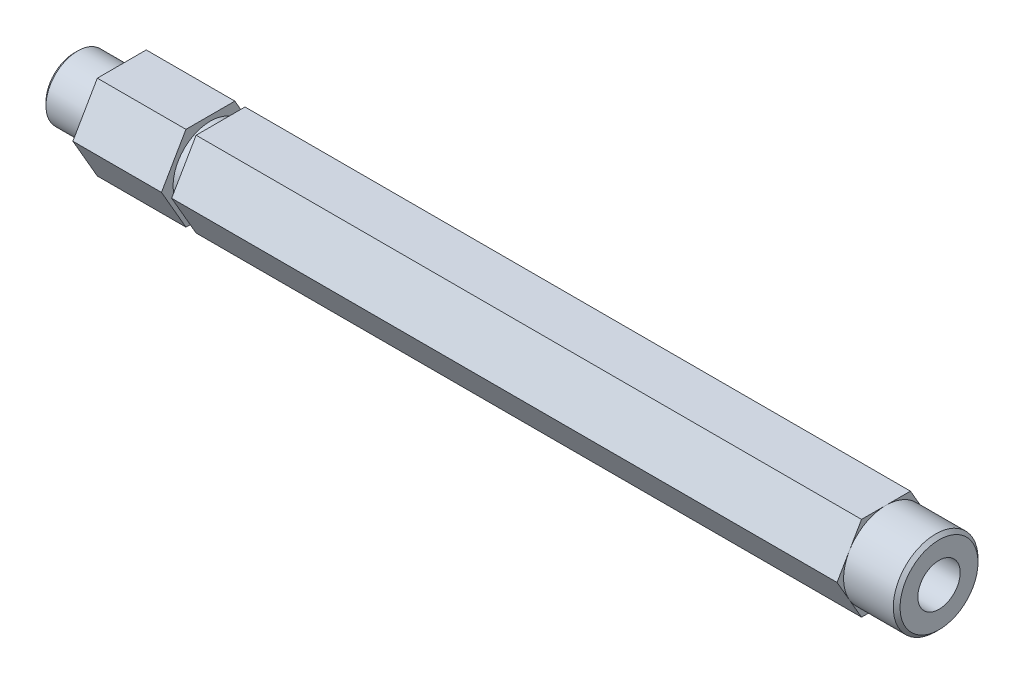
ISO-10303-21;
HEADER;
FILE_DESCRIPTION(('STEP AP214'),'2;1');
FILE_NAME('part.step','',(''),(''),'','','');
FILE_SCHEMA(('AUTOMOTIVE_DESIGN { 1 0 10303 214 1 1 1 1 }'));
ENDSEC;
DATA;
#1=APPLICATION_CONTEXT('core data for automotive mechanical design processes');
#2=APPLICATION_PROTOCOL_DEFINITION('international standard','automotive_design',2000,#1);
#3=PRODUCT_CONTEXT('',#1,'mechanical');
#4=PRODUCT('Part','Part','',(#3));
#5=PRODUCT_RELATED_PRODUCT_CATEGORY('part','',(#4));
#6=PRODUCT_DEFINITION_FORMATION('','',#4);
#7=PRODUCT_DEFINITION_CONTEXT('part definition',#1,'design');
#8=PRODUCT_DEFINITION('design','',#6,#7);
#9=PRODUCT_DEFINITION_SHAPE('','',#8);
#10=(LENGTH_UNIT() NAMED_UNIT(*) SI_UNIT(.MILLI.,.METRE.));
#11=(NAMED_UNIT(*) PLANE_ANGLE_UNIT() SI_UNIT($,.RADIAN.));
#12=(NAMED_UNIT(*) SI_UNIT($,.STERADIAN.) SOLID_ANGLE_UNIT());
#13=UNCERTAINTY_MEASURE_WITH_UNIT(LENGTH_MEASURE(1.E-05),#10,'distance_accuracy_value','');
#14=(GEOMETRIC_REPRESENTATION_CONTEXT(3) GLOBAL_UNCERTAINTY_ASSIGNED_CONTEXT((#13)) GLOBAL_UNIT_ASSIGNED_CONTEXT((#10,
#11,#12)) REPRESENTATION_CONTEXT('',''));
#15=CARTESIAN_POINT('',(0.,0.,0.));
#16=DIRECTION('',(0.,0.,1.));
#17=DIRECTION('',(1.,0.,0.));
#18=AXIS2_PLACEMENT_3D('',#15,#16,#17);
#19=CARTESIAN_POINT('',(0.508000000000008,0.,0.));
#20=DIRECTION('',(1.,0.,0.));
#21=DIRECTION('',(0.,0.,-1.));
#22=AXIS2_PLACEMENT_3D('',#19,#20,#21);
#23=CONICAL_SURFACE('',#22,4.7625,0.785398163397452);
#24=CARTESIAN_POINT('',(0.,0.,0.));
#25=DIRECTION('',(-1.,0.,0.));
#26=DIRECTION('',(0.,0.,-1.));
#27=AXIS2_PLACEMENT_3D('',#24,#25,#26);
#28=CIRCLE('',#27,4.2545);
#29=CARTESIAN_POINT('',(0.,0.,-4.2545));
#30=VERTEX_POINT('',#29);
#31=EDGE_CURVE('E303',#30,#30,#28,.T.);
#32=ORIENTED_EDGE('',*,*,#31,.F.);
#33=EDGE_LOOP('',(#32));
#34=FACE_BOUND('',#33,.T.);
#35=CARTESIAN_POINT('',(0.508000000000008,0.,0.));
#36=DIRECTION('',(1.,0.,0.));
#37=DIRECTION('',(0.,0.,-1.));
#38=AXIS2_PLACEMENT_3D('',#35,#36,#37);
#39=CIRCLE('',#38,4.7625);
#40=CARTESIAN_POINT('',(0.508000000000008,0.,-4.7625));
#41=VERTEX_POINT('',#40);
#42=EDGE_CURVE('E290',#41,#41,#39,.T.);
#43=ORIENTED_EDGE('',*,*,#42,.F.);
#44=EDGE_LOOP('',(#43));
#45=FACE_BOUND('',#44,.T.);
#46=ADVANCED_FACE('F16',(#34,#45),#23,.T.);
#47=CARTESIAN_POINT('',(129.6162,0.,0.));
#48=DIRECTION('',(-1.,0.,0.));
#49=DIRECTION('',(0.,0.,1.));
#50=AXIS2_PLACEMENT_3D('',#47,#48,#49);
#51=CONICAL_SURFACE('',#50,5.842,0.785398163397452);
#52=CARTESIAN_POINT('',(129.6162,0.,0.));
#53=DIRECTION('',(1.,0.,0.));
#54=DIRECTION('',(0.,0.,-1.));
#55=AXIS2_PLACEMENT_3D('',#52,#53,#54);
#56=CIRCLE('',#55,5.842);
#57=CARTESIAN_POINT('',(129.6162,0.,-5.842));
#58=VERTEX_POINT('',#57);
#59=EDGE_CURVE('E309',#58,#58,#56,.T.);
#60=ORIENTED_EDGE('',*,*,#59,.F.);
#61=EDGE_LOOP('',(#60));
#62=FACE_BOUND('',#61,.T.);
#63=CARTESIAN_POINT('',(129.1082,0.,0.));
#64=DIRECTION('',(-1.,0.,0.));
#65=DIRECTION('',(0.,0.,-1.));
#66=AXIS2_PLACEMENT_3D('',#63,#64,#65);
#67=CIRCLE('',#66,6.35);
#68=CARTESIAN_POINT('',(129.1082,0.,-6.35));
#69=VERTEX_POINT('',#68);
#70=EDGE_CURVE('E286',#69,#69,#67,.T.);
#71=ORIENTED_EDGE('',*,*,#70,.F.);
#72=EDGE_LOOP('',(#71));
#73=FACE_BOUND('',#72,.T.);
#74=ADVANCED_FACE('F758',(#62,#73),#51,.T.);
#75=CARTESIAN_POINT('',(129.6162,0.,0.));
#76=DIRECTION('',(1.,0.,0.));
#77=DIRECTION('',(0.,0.,-1.));
#78=AXIS2_PLACEMENT_3D('',#75,#76,#77);
#79=CYLINDRICAL_SURFACE('',#78,3.175);
#80=CARTESIAN_POINT('',(116.9162,0.,0.));
#81=DIRECTION('',(1.,0.,0.));
#82=DIRECTION('',(0.,0.,-1.));
#83=AXIS2_PLACEMENT_3D('',#80,#81,#82);
#84=CIRCLE('',#83,3.175);
#85=CARTESIAN_POINT('',(116.9162,0.,-3.175));
#86=VERTEX_POINT('',#85);
#87=EDGE_CURVE('E11',#86,#86,#84,.T.);
#88=ORIENTED_EDGE('',*,*,#87,.F.);
#89=EDGE_LOOP('',(#88));
#90=FACE_BOUND('',#89,.T.);
#91=CARTESIAN_POINT('',(129.6162,0.,0.));
#92=DIRECTION('',(1.,0.,0.));
#93=DIRECTION('',(0.,0.,-1.));
#94=AXIS2_PLACEMENT_3D('',#91,#92,#93);
#95=CIRCLE('',#94,3.175);
#96=CARTESIAN_POINT('',(129.6162,0.,-3.175));
#97=VERTEX_POINT('',#96);
#98=EDGE_CURVE('E341',#97,#97,#95,.T.);
#99=ORIENTED_EDGE('',*,*,#98,.T.);
#100=EDGE_LOOP('',(#99));
#101=FACE_BOUND('',#100,.T.);
#102=ADVANCED_FACE('F721',(#90,#101),#79,.F.);
#103=CARTESIAN_POINT('',(116.9162,0.,0.));
#104=DIRECTION('',(1.,0.,0.));
#105=DIRECTION('',(0.,0.,-1.));
#106=AXIS2_PLACEMENT_3D('',#103,#104,#105);
#107=CONICAL_SURFACE('',#106,3.175,1.02974425867665);
#108=CARTESIAN_POINT('',(115.008467534587,0.,0.));
#109=VERTEX_POINT('',#108);
#110=VERTEX_LOOP('',#109);
#111=FACE_BOUND('',#110,.T.);
#112=ORIENTED_EDGE('',*,*,#87,.T.);
#113=EDGE_LOOP('',(#112));
#114=FACE_BOUND('',#113,.T.);
#115=ADVANCED_FACE('F642',(#111,#114),#107,.F.);
#116=CARTESIAN_POINT('',(0.,0.,0.));
#117=DIRECTION('',(-1.,0.,0.));
#118=DIRECTION('',(0.,0.,1.));
#119=AXIS2_PLACEMENT_3D('',#116,#117,#118);
#120=CYLINDRICAL_SURFACE('',#119,3.175);
#121=CARTESIAN_POINT('',(12.7,0.,0.));
#122=DIRECTION('',(-1.,0.,0.));
#123=DIRECTION('',(0.,0.,1.));
#124=AXIS2_PLACEMENT_3D('',#121,#122,#123);
#125=CIRCLE('',#124,3.175);
#126=CARTESIAN_POINT('',(12.7,0.,3.175));
#127=VERTEX_POINT('',#126);
#128=EDGE_CURVE('E26',#127,#127,#125,.T.);
#129=ORIENTED_EDGE('',*,*,#128,.F.);
#130=EDGE_LOOP('',(#129));
#131=FACE_BOUND('',#130,.T.);
#132=CARTESIAN_POINT('',(0.,0.,0.));
#133=DIRECTION('',(-1.,0.,0.));
#134=DIRECTION('',(0.,0.,1.));
#135=AXIS2_PLACEMENT_3D('',#132,#133,#134);
#136=CIRCLE('',#135,3.175);
#137=CARTESIAN_POINT('',(0.,0.,3.175));
#138=VERTEX_POINT('',#137);
#139=EDGE_CURVE('E306',#138,#138,#136,.T.);
#140=ORIENTED_EDGE('',*,*,#139,.T.);
#141=EDGE_LOOP('',(#140));
#142=FACE_BOUND('',#141,.T.);
#143=ADVANCED_FACE('F636',(#131,#142),#120,.F.);
#144=CARTESIAN_POINT('',(12.7,0.,0.));
#145=DIRECTION('',(-1.,0.,0.));
#146=DIRECTION('',(0.,0.,1.));
#147=AXIS2_PLACEMENT_3D('',#144,#145,#146);
#148=CONICAL_SURFACE('',#147,3.175,1.02974425867665);
#149=CARTESIAN_POINT('',(14.6077324654125,0.,0.));
#150=VERTEX_POINT('',#149);
#151=VERTEX_LOOP('',#150);
#152=FACE_BOUND('',#151,.T.);
#153=ORIENTED_EDGE('',*,*,#128,.T.);
#154=EDGE_LOOP('',(#153));
#155=FACE_BOUND('',#154,.T.);
#156=ADVANCED_FACE('F641',(#152,#155),#148,.F.);
#157=CARTESIAN_POINT('',(129.6162,0.,0.));
#158=DIRECTION('',(1.,0.,0.));
#159=DIRECTION('',(0.,1.,0.));
#160=AXIS2_PLACEMENT_3D('',#157,#158,#159);
#161=PLANE('',#160);
#162=ORIENTED_EDGE('',*,*,#98,.F.);
#163=EDGE_LOOP('',(#162));
#164=FACE_BOUND('',#163,.T.);
#165=ORIENTED_EDGE('',*,*,#59,.T.);
#166=EDGE_LOOP('',(#165));
#167=FACE_BOUND('',#166,.T.);
#168=ADVANCED_FACE('F607',(#164,#167),#161,.T.);
#169=CARTESIAN_POINT('',(129.6162,0.,0.));
#170=DIRECTION('',(-1.,0.,0.));
#171=DIRECTION('',(0.,0.,1.));
#172=AXIS2_PLACEMENT_3D('',#169,#170,#171);
#173=CYLINDRICAL_SURFACE('',#172,6.35);
#174=ORIENTED_EDGE('',*,*,#70,.T.);
#175=EDGE_LOOP('',(#174));
#176=FACE_BOUND('',#175,.T.);
#177=CARTESIAN_POINT('',(121.666,0.,0.));
#178=DIRECTION('',(1.,0.,0.));
#179=DIRECTION('',(0.,0.,-1.));
#180=AXIS2_PLACEMENT_3D('',#177,#178,#179);
#181=CIRCLE('',#180,6.35);
#182=CARTESIAN_POINT('',(121.666,3.175,-5.49926131403118));
#183=VERTEX_POINT('',#182);
#184=CARTESIAN_POINT('',(121.666,6.35,0.));
#185=VERTEX_POINT('',#184);
#186=EDGE_CURVE('E321',#183,#185,#181,.T.);
#187=ORIENTED_EDGE('',*,*,#186,.T.);
#188=CARTESIAN_POINT('',(121.666,0.,0.));
#189=DIRECTION('',(1.,0.,0.));
#190=DIRECTION('',(0.,0.,-1.));
#191=AXIS2_PLACEMENT_3D('',#188,#189,#190);
#192=CIRCLE('',#191,6.35);
#193=CARTESIAN_POINT('',(121.666,3.175,5.4992613140312));
#194=VERTEX_POINT('',#193);
#195=EDGE_CURVE('E260',#185,#194,#192,.T.);
#196=ORIENTED_EDGE('',*,*,#195,.T.);
#197=CARTESIAN_POINT('',(121.666,0.,0.));
#198=DIRECTION('',(1.,0.,0.));
#199=DIRECTION('',(0.,0.,-1.));
#200=AXIS2_PLACEMENT_3D('',#197,#198,#199);
#201=CIRCLE('',#200,6.35);
#202=CARTESIAN_POINT('',(121.666,-3.175,5.49926131403117));
#203=VERTEX_POINT('',#202);
#204=EDGE_CURVE('E245',#194,#203,#201,.T.);
#205=ORIENTED_EDGE('',*,*,#204,.T.);
#206=CARTESIAN_POINT('',(121.666,0.,0.));
#207=DIRECTION('',(1.,0.,0.));
#208=DIRECTION('',(0.,0.,-1.));
#209=AXIS2_PLACEMENT_3D('',#206,#207,#208);
#210=CIRCLE('',#209,6.35);
#211=CARTESIAN_POINT('',(121.666,-6.35,0.));
#212=VERTEX_POINT('',#211);
#213=EDGE_CURVE('E335',#203,#212,#210,.T.);
#214=ORIENTED_EDGE('',*,*,#213,.T.);
#215=CARTESIAN_POINT('',(121.666,0.,0.));
#216=DIRECTION('',(1.,0.,0.));
#217=DIRECTION('',(0.,0.,-1.));
#218=AXIS2_PLACEMENT_3D('',#215,#216,#217);
#219=CIRCLE('',#218,6.35);
#220=CARTESIAN_POINT('',(121.666,-3.175,-5.49926131403118));
#221=VERTEX_POINT('',#220);
#222=EDGE_CURVE('E345',#212,#221,#219,.T.);
#223=ORIENTED_EDGE('',*,*,#222,.T.);
#224=CARTESIAN_POINT('',(121.666,0.,0.));
#225=DIRECTION('',(1.,0.,0.));
#226=DIRECTION('',(0.,0.,-1.));
#227=AXIS2_PLACEMENT_3D('',#224,#225,#226);
#228=CIRCLE('',#227,6.35);
#229=EDGE_CURVE('E283',#221,#183,#228,.T.);
#230=ORIENTED_EDGE('',*,*,#229,.T.);
#231=EDGE_LOOP('',(#187,#196,#205,#214,#223,#230));
#232=FACE_BOUND('',#231,.T.);
#233=ADVANCED_FACE('F601',(#176,#232),#173,.T.);
#234=CARTESIAN_POINT('',(121.666,0.,0.));
#235=DIRECTION('',(1.,0.,0.));
#236=DIRECTION('',(0.,1.,0.));
#237=AXIS2_PLACEMENT_3D('',#234,#235,#236);
#238=PLANE('',#237);
#239=ORIENTED_EDGE('',*,*,#229,.F.);
#240=DIRECTION('',(0.,0.866025403784439,-0.5));
#241=VECTOR('',#240,1.);
#242=CARTESIAN_POINT('',(121.666,-6.35,-3.66617420935412));
#243=LINE('',#242,#241);
#244=CARTESIAN_POINT('',(121.666,0.,-7.33234841870824));
#245=VERTEX_POINT('',#244);
#246=EDGE_CURVE('E216',#221,#245,#243,.T.);
#247=ORIENTED_EDGE('',*,*,#246,.T.);
#248=DIRECTION('',(0.,0.866025403784439,0.5));
#249=VECTOR('',#248,1.);
#250=CARTESIAN_POINT('',(121.666,0.,-7.33234841870824));
#251=LINE('',#250,#249);
#252=EDGE_CURVE('E302',#245,#183,#251,.T.);
#253=ORIENTED_EDGE('',*,*,#252,.T.);
#254=EDGE_LOOP('',(#239,#247,#253));
#255=FACE_BOUND('',#254,.T.);
#256=ADVANCED_FACE('F606',(#255),#238,.T.);
#257=CARTESIAN_POINT('',(121.666,-6.35,3.66617420935411));
#258=DIRECTION('',(0.,1.,0.));
#259=DIRECTION('',(0.,0.,-1.));
#260=AXIS2_PLACEMENT_3D('',#257,#258,#259);
#261=PLANE('',#260);
#262=DIRECTION('',(0.,0.,-1.));
#263=VECTOR('',#262,1.);
#264=CARTESIAN_POINT('',(21.9202,-6.35,3.66617420935411));
#265=LINE('',#264,#263);
#266=CARTESIAN_POINT('',(21.9202,-6.35,3.66617420935411));
#267=VERTEX_POINT('',#266);
#268=CARTESIAN_POINT('',(21.9202,-6.35,-3.66617420935412));
#269=VERTEX_POINT('',#268);
#270=EDGE_CURVE('E219',#267,#269,#265,.T.);
#271=ORIENTED_EDGE('',*,*,#270,.T.);
#272=DIRECTION('',(-1.,0.,0.));
#273=VECTOR('',#272,1.);
#274=CARTESIAN_POINT('',(121.666,-6.35,-3.66617420935412));
#275=LINE('',#274,#273);
#276=CARTESIAN_POINT('',(121.666,-6.35,-3.66617420935412));
#277=VERTEX_POINT('',#276);
#278=EDGE_CURVE('E203',#277,#269,#275,.T.);
#279=ORIENTED_EDGE('',*,*,#278,.F.);
#280=DIRECTION('',(0.,0.,-1.));
#281=VECTOR('',#280,1.);
#282=CARTESIAN_POINT('',(121.666,-6.35,3.66617420935411));
#283=LINE('',#282,#281);
#284=EDGE_CURVE('E295',#212,#277,#283,.T.);
#285=ORIENTED_EDGE('',*,*,#284,.F.);
#286=DIRECTION('',(0.,0.,-1.));
#287=VECTOR('',#286,1.);
#288=CARTESIAN_POINT('',(121.666,-6.35,3.66617420935411));
#289=LINE('',#288,#287);
#290=CARTESIAN_POINT('',(121.666,-6.35,3.66617420935411));
#291=VERTEX_POINT('',#290);
#292=EDGE_CURVE('E334',#291,#212,#289,.T.);
#293=ORIENTED_EDGE('',*,*,#292,.F.);
#294=DIRECTION('',(-1.,0.,0.));
#295=VECTOR('',#294,1.);
#296=CARTESIAN_POINT('',(121.666,-6.35,3.66617420935411));
#297=LINE('',#296,#295);
#298=EDGE_CURVE('E222',#291,#267,#297,.T.);
#299=ORIENTED_EDGE('',*,*,#298,.T.);
#300=EDGE_LOOP('',(#271,#279,#285,#293,#299));
#301=FACE_BOUND('',#300,.T.);
#302=ADVANCED_FACE('F220',(#301),#261,.F.);
#303=CARTESIAN_POINT('',(121.666,0.,7.33234841870825));
#304=DIRECTION('',(0.,0.5,-0.866025403784438));
#305=DIRECTION('',(-1.,0.,0.));
#306=AXIS2_PLACEMENT_3D('',#303,#304,#305);
#307=PLANE('',#306);
#308=DIRECTION('',(0.,-0.866025403784439,-0.5));
#309=VECTOR('',#308,1.);
#310=CARTESIAN_POINT('',(21.9202,0.,7.33234841870825));
#311=LINE('',#310,#309);
#312=CARTESIAN_POINT('',(21.9202,0.,7.33234841870825));
#313=VERTEX_POINT('',#312);
#314=EDGE_CURVE('E227',#313,#267,#311,.T.);
#315=ORIENTED_EDGE('',*,*,#314,.T.);
#316=ORIENTED_EDGE('',*,*,#298,.F.);
#317=DIRECTION('',(0.,-0.866025403784439,-0.5));
#318=VECTOR('',#317,1.);
#319=CARTESIAN_POINT('',(121.666,0.,7.33234841870825));
#320=LINE('',#319,#318);
#321=EDGE_CURVE('E331',#203,#291,#320,.T.);
#322=ORIENTED_EDGE('',*,*,#321,.F.);
#323=DIRECTION('',(0.,-0.866025403784439,-0.5));
#324=VECTOR('',#323,1.);
#325=CARTESIAN_POINT('',(121.666,0.,7.33234841870825));
#326=LINE('',#325,#324);
#327=CARTESIAN_POINT('',(121.666,0.,7.33234841870825));
#328=VERTEX_POINT('',#327);
#329=EDGE_CURVE('E251',#328,#203,#326,.T.);
#330=ORIENTED_EDGE('',*,*,#329,.F.);
#331=DIRECTION('',(-1.,0.,0.));
#332=VECTOR('',#331,1.);
#333=CARTESIAN_POINT('',(121.666,0.,7.33234841870825));
#334=LINE('',#333,#332);
#335=EDGE_CURVE('E265',#328,#313,#334,.T.);
#336=ORIENTED_EDGE('',*,*,#335,.T.);
#337=EDGE_LOOP('',(#315,#316,#322,#330,#336));
#338=FACE_BOUND('',#337,.T.);
#339=ADVANCED_FACE('F689',(#338),#307,.F.);
#340=CARTESIAN_POINT('',(121.666,6.35,3.66617420935411));
#341=DIRECTION('',(0.,-0.5,-0.866025403784439));
#342=DIRECTION('',(0.,-0.866025403784439,0.5));
#343=AXIS2_PLACEMENT_3D('',#340,#341,#342);
#344=PLANE('',#343);
#345=DIRECTION('',(0.,-0.866025403784439,0.5));
#346=VECTOR('',#345,1.);
#347=CARTESIAN_POINT('',(21.9202,6.35,3.66617420935411));
#348=LINE('',#347,#346);
#349=CARTESIAN_POINT('',(21.9202,6.35,3.66617420935411));
#350=VERTEX_POINT('',#349);
#351=EDGE_CURVE('E254',#350,#313,#348,.T.);
#352=ORIENTED_EDGE('',*,*,#351,.T.);
#353=ORIENTED_EDGE('',*,*,#335,.F.);
#354=DIRECTION('',(0.,-0.866025403784439,0.5));
#355=VECTOR('',#354,1.);
#356=CARTESIAN_POINT('',(121.666,6.35,3.66617420935411));
#357=LINE('',#356,#355);
#358=EDGE_CURVE('E247',#194,#328,#357,.T.);
#359=ORIENTED_EDGE('',*,*,#358,.F.);
#360=DIRECTION('',(0.,-0.866025403784439,0.5));
#361=VECTOR('',#360,1.);
#362=CARTESIAN_POINT('',(121.666,6.35,3.66617420935411));
#363=LINE('',#362,#361);
#364=CARTESIAN_POINT('',(121.666,6.35,3.66617420935411));
#365=VERTEX_POINT('',#364);
#366=EDGE_CURVE('E259',#365,#194,#363,.T.);
#367=ORIENTED_EDGE('',*,*,#366,.F.);
#368=DIRECTION('',(-1.,0.,0.));
#369=VECTOR('',#368,1.);
#370=CARTESIAN_POINT('',(121.666,6.35,3.66617420935411));
#371=LINE('',#370,#369);
#372=EDGE_CURVE('E268',#365,#350,#371,.T.);
#373=ORIENTED_EDGE('',*,*,#372,.T.);
#374=EDGE_LOOP('',(#352,#353,#359,#367,#373));
#375=FACE_BOUND('',#374,.T.);
#376=ADVANCED_FACE('F699',(#375),#344,.F.);
#377=CARTESIAN_POINT('',(121.666,6.35,-3.66617420935412));
#378=DIRECTION('',(0.,-1.,0.));
#379=DIRECTION('',(0.,0.,-1.));
#380=AXIS2_PLACEMENT_3D('',#377,#378,#379);
#381=PLANE('',#380);
#382=DIRECTION('',(0.,0.,1.));
#383=VECTOR('',#382,1.);
#384=CARTESIAN_POINT('',(21.9202,6.35,-3.66617420935412));
#385=LINE('',#384,#383);
#386=CARTESIAN_POINT('',(21.9202,6.35,-3.66617420935412));
#387=VERTEX_POINT('',#386);
#388=EDGE_CURVE('E272',#387,#350,#385,.T.);
#389=ORIENTED_EDGE('',*,*,#388,.T.);
#390=ORIENTED_EDGE('',*,*,#372,.F.);
#391=DIRECTION('',(0.,0.,1.));
#392=VECTOR('',#391,1.);
#393=CARTESIAN_POINT('',(121.666,6.35,-3.66617420935412));
#394=LINE('',#393,#392);
#395=EDGE_CURVE('E255',#185,#365,#394,.T.);
#396=ORIENTED_EDGE('',*,*,#395,.F.);
#397=DIRECTION('',(0.,0.,1.));
#398=VECTOR('',#397,1.);
#399=CARTESIAN_POINT('',(121.666,6.35,-3.66617420935412));
#400=LINE('',#399,#398);
#401=CARTESIAN_POINT('',(121.666,6.35,-3.66617420935412));
#402=VERTEX_POINT('',#401);
#403=EDGE_CURVE('E320',#402,#185,#400,.T.);
#404=ORIENTED_EDGE('',*,*,#403,.F.);
#405=DIRECTION('',(-1.,0.,0.));
#406=VECTOR('',#405,1.);
#407=CARTESIAN_POINT('',(121.666,6.35,-3.66617420935412));
#408=LINE('',#407,#406);
#409=EDGE_CURVE('E215',#402,#387,#408,.T.);
#410=ORIENTED_EDGE('',*,*,#409,.T.);
#411=EDGE_LOOP('',(#389,#390,#396,#404,#410));
#412=FACE_BOUND('',#411,.T.);
#413=ADVANCED_FACE('F555',(#412),#381,.F.);
#414=CARTESIAN_POINT('',(121.666,0.,-7.33234841870824));
#415=DIRECTION('',(0.,-0.5,0.866025403784438));
#416=DIRECTION('',(-1.,0.,0.));
#417=AXIS2_PLACEMENT_3D('',#414,#415,#416);
#418=PLANE('',#417);
#419=DIRECTION('',(0.,0.866025403784439,0.5));
#420=VECTOR('',#419,1.);
#421=CARTESIAN_POINT('',(21.9202,0.,-7.33234841870824));
#422=LINE('',#421,#420);
#423=CARTESIAN_POINT('',(21.9202,0.,-7.33234841870824));
#424=VERTEX_POINT('',#423);
#425=EDGE_CURVE('E233',#424,#387,#422,.T.);
#426=ORIENTED_EDGE('',*,*,#425,.T.);
#427=ORIENTED_EDGE('',*,*,#409,.F.);
#428=DIRECTION('',(0.,0.866025403784439,0.5));
#429=VECTOR('',#428,1.);
#430=CARTESIAN_POINT('',(121.666,0.,-7.33234841870824));
#431=LINE('',#430,#429);
#432=EDGE_CURVE('E316',#183,#402,#431,.T.);
#433=ORIENTED_EDGE('',*,*,#432,.F.);
#434=ORIENTED_EDGE('',*,*,#252,.F.);
#435=DIRECTION('',(-1.,0.,0.));
#436=VECTOR('',#435,1.);
#437=CARTESIAN_POINT('',(121.666,0.,-7.33234841870824));
#438=LINE('',#437,#436);
#439=EDGE_CURVE('E310',#245,#424,#438,.T.);
#440=ORIENTED_EDGE('',*,*,#439,.T.);
#441=EDGE_LOOP('',(#426,#427,#433,#434,#440));
#442=FACE_BOUND('',#441,.T.);
#443=ADVANCED_FACE('F550',(#442),#418,.F.);
#444=CARTESIAN_POINT('',(121.666,-6.35,-3.66617420935412));
#445=DIRECTION('',(0.,0.5,0.866025403784439));
#446=DIRECTION('',(1.,0.,0.));
#447=AXIS2_PLACEMENT_3D('',#444,#445,#446);
#448=PLANE('',#447);
#449=DIRECTION('',(0.,0.866025403784439,-0.5));
#450=VECTOR('',#449,1.);
#451=CARTESIAN_POINT('',(21.9202,-6.35,-3.66617420935412));
#452=LINE('',#451,#450);
#453=EDGE_CURVE('E208',#269,#424,#452,.T.);
#454=ORIENTED_EDGE('',*,*,#453,.T.);
#455=ORIENTED_EDGE('',*,*,#439,.F.);
#456=ORIENTED_EDGE('',*,*,#246,.F.);
#457=DIRECTION('',(0.,0.866025403784439,-0.5));
#458=VECTOR('',#457,1.);
#459=CARTESIAN_POINT('',(121.666,-6.35,-3.66617420935412));
#460=LINE('',#459,#458);
#461=EDGE_CURVE('E211',#277,#221,#460,.T.);
#462=ORIENTED_EDGE('',*,*,#461,.F.);
#463=ORIENTED_EDGE('',*,*,#278,.T.);
#464=EDGE_LOOP('',(#454,#455,#456,#462,#463));
#465=FACE_BOUND('',#464,.T.);
#466=ADVANCED_FACE('F205',(#465),#448,.F.);
#467=CARTESIAN_POINT('',(21.9202,0.,0.));
#468=DIRECTION('',(1.,0.,0.));
#469=DIRECTION('',(0.,1.,0.));
#470=AXIS2_PLACEMENT_3D('',#467,#468,#469);
#471=PLANE('',#470);
#472=CARTESIAN_POINT('',(21.9202,0.,0.));
#473=DIRECTION('',(1.,0.,0.));
#474=DIRECTION('',(0.,0.,-1.));
#475=AXIS2_PLACEMENT_3D('',#472,#473,#474);
#476=CIRCLE('',#475,5.588);
#477=CARTESIAN_POINT('',(21.9202,0.,-5.588));
#478=VERTEX_POINT('',#477);
#479=EDGE_CURVE('E235',#478,#478,#476,.T.);
#480=ORIENTED_EDGE('',*,*,#479,.T.);
#481=EDGE_LOOP('',(#480));
#482=FACE_BOUND('',#481,.T.);
#483=ORIENTED_EDGE('',*,*,#453,.F.);
#484=ORIENTED_EDGE('',*,*,#270,.F.);
#485=ORIENTED_EDGE('',*,*,#314,.F.);
#486=ORIENTED_EDGE('',*,*,#351,.F.);
#487=ORIENTED_EDGE('',*,*,#388,.F.);
#488=ORIENTED_EDGE('',*,*,#425,.F.);
#489=EDGE_LOOP('',(#483,#484,#485,#486,#487,#488));
#490=FACE_BOUND('',#489,.T.);
#491=ADVANCED_FACE('F230',(#482,#490),#471,.F.);
#492=CARTESIAN_POINT('',(21.9202,0.,0.));
#493=DIRECTION('',(-1.,0.,0.));
#494=DIRECTION('',(0.,0.,1.));
#495=AXIS2_PLACEMENT_3D('',#492,#493,#494);
#496=CYLINDRICAL_SURFACE('',#495,5.588);
#497=ORIENTED_EDGE('',*,*,#479,.F.);
#498=EDGE_LOOP('',(#497));
#499=FACE_BOUND('',#498,.T.);
#500=CARTESIAN_POINT('',(20.3962,0.,0.));
#501=DIRECTION('',(1.,0.,0.));
#502=DIRECTION('',(0.,0.,-1.));
#503=AXIS2_PLACEMENT_3D('',#500,#501,#502);
#504=CIRCLE('',#503,5.588);
#505=CARTESIAN_POINT('',(20.3962,0.,-5.588));
#506=VERTEX_POINT('',#505);
#507=EDGE_CURVE('E291',#506,#506,#504,.T.);
#508=ORIENTED_EDGE('',*,*,#507,.T.);
#509=EDGE_LOOP('',(#508));
#510=FACE_BOUND('',#509,.T.);
#511=ADVANCED_FACE('F619',(#499,#510),#496,.T.);
#512=CARTESIAN_POINT('',(20.3962,-6.35,3.66617420935411));
#513=DIRECTION('',(0.,1.,0.));
#514=DIRECTION('',(0.,0.,-1.));
#515=AXIS2_PLACEMENT_3D('',#512,#513,#514);
#516=PLANE('',#515);
#517=DIRECTION('',(0.,0.,-1.));
#518=VECTOR('',#517,1.);
#519=CARTESIAN_POINT('',(7.112,-6.35,3.66617420935411));
#520=LINE('',#519,#518);
#521=CARTESIAN_POINT('',(7.112,-6.35,3.66617420935411));
#522=VERTEX_POINT('',#521);
#523=CARTESIAN_POINT('',(7.112,-6.35,-3.66617420935412));
#524=VERTEX_POINT('',#523);
#525=EDGE_CURVE('E299',#522,#524,#520,.T.);
#526=ORIENTED_EDGE('',*,*,#525,.T.);
#527=DIRECTION('',(-1.,0.,0.));
#528=VECTOR('',#527,1.);
#529=CARTESIAN_POINT('',(20.3962,-6.35,-3.66617420935412));
#530=LINE('',#529,#528);
#531=CARTESIAN_POINT('',(20.3962,-6.35,-3.66617420935412));
#532=VERTEX_POINT('',#531);
#533=EDGE_CURVE('E261',#532,#524,#530,.T.);
#534=ORIENTED_EDGE('',*,*,#533,.F.);
#535=DIRECTION('',(0.,0.,-1.));
#536=VECTOR('',#535,1.);
#537=CARTESIAN_POINT('',(20.3962,-6.35,3.66617420935411));
#538=LINE('',#537,#536);
#539=CARTESIAN_POINT('',(20.3962,-6.35,3.66617420935411));
#540=VERTEX_POINT('',#539);
#541=EDGE_CURVE('E370',#540,#532,#538,.T.);
#542=ORIENTED_EDGE('',*,*,#541,.F.);
#543=DIRECTION('',(-1.,0.,0.));
#544=VECTOR('',#543,1.);
#545=CARTESIAN_POINT('',(20.3962,-6.35,3.66617420935411));
#546=LINE('',#545,#544);
#547=EDGE_CURVE('E241',#540,#522,#546,.T.);
#548=ORIENTED_EDGE('',*,*,#547,.T.);
#549=EDGE_LOOP('',(#526,#534,#542,#548));
#550=FACE_BOUND('',#549,.T.);
#551=ADVANCED_FACE('F381',(#550),#516,.F.);
#552=CARTESIAN_POINT('',(20.3962,0.,7.33234841870825));
#553=DIRECTION('',(0.,0.5,-0.866025403784439));
#554=DIRECTION('',(-1.,0.,0.));
#555=AXIS2_PLACEMENT_3D('',#552,#553,#554);
#556=PLANE('',#555);
#557=DIRECTION('',(0.,-0.866025403784439,-0.5));
#558=VECTOR('',#557,1.);
#559=CARTESIAN_POINT('',(7.112,0.,7.33234841870825));
#560=LINE('',#559,#558);
#561=CARTESIAN_POINT('',(7.112,0.,7.33234841870825));
#562=VERTEX_POINT('',#561);
#563=EDGE_CURVE('E278',#562,#522,#560,.T.);
#564=ORIENTED_EDGE('',*,*,#563,.T.);
#565=ORIENTED_EDGE('',*,*,#547,.F.);
#566=DIRECTION('',(0.,-0.866025403784439,-0.5));
#567=VECTOR('',#566,1.);
#568=CARTESIAN_POINT('',(20.3962,0.,7.33234841870825));
#569=LINE('',#568,#567);
#570=CARTESIAN_POINT('',(20.3962,0.,7.33234841870825));
#571=VERTEX_POINT('',#570);
#572=EDGE_CURVE('E352',#571,#540,#569,.T.);
#573=ORIENTED_EDGE('',*,*,#572,.F.);
#574=DIRECTION('',(-1.,0.,0.));
#575=VECTOR('',#574,1.);
#576=CARTESIAN_POINT('',(20.3962,0.,7.33234841870825));
#577=LINE('',#576,#575);
#578=EDGE_CURVE('E328',#571,#562,#577,.T.);
#579=ORIENTED_EDGE('',*,*,#578,.T.);
#580=EDGE_LOOP('',(#564,#565,#573,#579));
#581=FACE_BOUND('',#580,.T.);
#582=ADVANCED_FACE('F579',(#581),#556,.F.);
#583=CARTESIAN_POINT('',(20.3962,6.35,3.66617420935414));
#584=DIRECTION('',(0.,-0.5,-0.866025403784439));
#585=DIRECTION('',(0.,-0.866025403784439,0.5));
#586=AXIS2_PLACEMENT_3D('',#583,#584,#585);
#587=PLANE('',#586);
#588=DIRECTION('',(0.,-0.866025403784439,0.5));
#589=VECTOR('',#588,1.);
#590=CARTESIAN_POINT('',(7.112,6.35,3.66617420935414));
#591=LINE('',#590,#589);
#592=CARTESIAN_POINT('',(7.112,6.35,3.66617420935414));
#593=VERTEX_POINT('',#592);
#594=EDGE_CURVE('E273',#593,#562,#591,.T.);
#595=ORIENTED_EDGE('',*,*,#594,.T.);
#596=ORIENTED_EDGE('',*,*,#578,.F.);
#597=DIRECTION('',(0.,-0.866025403784439,0.5));
#598=VECTOR('',#597,1.);
#599=CARTESIAN_POINT('',(20.3962,6.35,3.66617420935414));
#600=LINE('',#599,#598);
#601=CARTESIAN_POINT('',(20.3962,6.35,3.66617420935414));
#602=VERTEX_POINT('',#601);
#603=EDGE_CURVE('E348',#602,#571,#600,.T.);
#604=ORIENTED_EDGE('',*,*,#603,.F.);
#605=DIRECTION('',(-1.,0.,0.));
#606=VECTOR('',#605,1.);
#607=CARTESIAN_POINT('',(20.3962,6.35,3.66617420935414));
#608=LINE('',#607,#606);
#609=EDGE_CURVE('E325',#602,#593,#608,.T.);
#610=ORIENTED_EDGE('',*,*,#609,.T.);
#611=EDGE_LOOP('',(#595,#596,#604,#610));
#612=FACE_BOUND('',#611,.T.);
#613=ADVANCED_FACE('F570',(#612),#587,.F.);
#614=CARTESIAN_POINT('',(20.3962,6.35,-3.66617420935411));
#615=DIRECTION('',(0.,-1.,0.));
#616=DIRECTION('',(-1.,0.,0.));
#617=AXIS2_PLACEMENT_3D('',#614,#615,#616);
#618=PLANE('',#617);
#619=DIRECTION('',(0.,0.,1.));
#620=VECTOR('',#619,1.);
#621=CARTESIAN_POINT('',(7.112,6.35,-3.66617420935411));
#622=LINE('',#621,#620);
#623=CARTESIAN_POINT('',(7.112,6.35,-3.66617420935411));
#624=VERTEX_POINT('',#623);
#625=EDGE_CURVE('E277',#624,#593,#622,.T.);
#626=ORIENTED_EDGE('',*,*,#625,.T.);
#627=ORIENTED_EDGE('',*,*,#609,.F.);
#628=DIRECTION('',(0.,0.,1.));
#629=VECTOR('',#628,1.);
#630=CARTESIAN_POINT('',(20.3962,6.35,-3.66617420935411));
#631=LINE('',#630,#629);
#632=CARTESIAN_POINT('',(20.3962,6.35,-3.66617420935411));
#633=VERTEX_POINT('',#632);
#634=EDGE_CURVE('E353',#633,#602,#631,.T.);
#635=ORIENTED_EDGE('',*,*,#634,.F.);
#636=DIRECTION('',(-1.,0.,0.));
#637=VECTOR('',#636,1.);
#638=CARTESIAN_POINT('',(20.3962,6.35,-3.66617420935411));
#639=LINE('',#638,#637);
#640=EDGE_CURVE('E264',#633,#624,#639,.T.);
#641=ORIENTED_EDGE('',*,*,#640,.T.);
#642=EDGE_LOOP('',(#626,#627,#635,#641));
#643=FACE_BOUND('',#642,.T.);
#644=ADVANCED_FACE('F564',(#643),#618,.F.);
#645=CARTESIAN_POINT('',(20.3962,0.,-7.33234841870825));
#646=DIRECTION('',(0.,-0.5,0.866025403784439));
#647=DIRECTION('',(-1.,0.,0.));
#648=AXIS2_PLACEMENT_3D('',#645,#646,#647);
#649=PLANE('',#648);
#650=DIRECTION('',(0.,0.866025403784439,0.5));
#651=VECTOR('',#650,1.);
#652=CARTESIAN_POINT('',(7.112,0.,-7.33234841870825));
#653=LINE('',#652,#651);
#654=CARTESIAN_POINT('',(7.112,0.,-7.33234841870825));
#655=VERTEX_POINT('',#654);
#656=EDGE_CURVE('E282',#655,#624,#653,.T.);
#657=ORIENTED_EDGE('',*,*,#656,.T.);
#658=ORIENTED_EDGE('',*,*,#640,.F.);
#659=DIRECTION('',(0.,0.866025403784439,0.5));
#660=VECTOR('',#659,1.);
#661=CARTESIAN_POINT('',(20.3962,0.,-7.33234841870825));
#662=LINE('',#661,#660);
#663=CARTESIAN_POINT('',(20.3962,0.,-7.33234841870825));
#664=VERTEX_POINT('',#663);
#665=EDGE_CURVE('E397',#664,#633,#662,.T.);
#666=ORIENTED_EDGE('',*,*,#665,.F.);
#667=DIRECTION('',(-1.,0.,0.));
#668=VECTOR('',#667,1.);
#669=CARTESIAN_POINT('',(20.3962,0.,-7.33234841870825));
#670=LINE('',#669,#668);
#671=EDGE_CURVE('E20',#664,#655,#670,.T.);
#672=ORIENTED_EDGE('',*,*,#671,.T.);
#673=EDGE_LOOP('',(#657,#658,#666,#672));
#674=FACE_BOUND('',#673,.T.);
#675=ADVANCED_FACE('F569',(#674),#649,.F.);
#676=CARTESIAN_POINT('',(20.3962,-6.35,-3.66617420935412));
#677=DIRECTION('',(0.,0.5,0.866025403784439));
#678=DIRECTION('',(1.,0.,0.));
#679=AXIS2_PLACEMENT_3D('',#676,#677,#678);
#680=PLANE('',#679);
#681=DIRECTION('',(0.,0.866025403784439,-0.5));
#682=VECTOR('',#681,1.);
#683=CARTESIAN_POINT('',(7.112,-6.35,-3.66617420935412));
#684=LINE('',#683,#682);
#685=EDGE_CURVE('E357',#524,#655,#684,.T.);
#686=ORIENTED_EDGE('',*,*,#685,.T.);
#687=ORIENTED_EDGE('',*,*,#671,.F.);
#688=DIRECTION('',(0.,0.866025403784439,-0.5));
#689=VECTOR('',#688,1.);
#690=CARTESIAN_POINT('',(20.3962,-6.35,-3.66617420935412));
#691=LINE('',#690,#689);
#692=EDGE_CURVE('E294',#532,#664,#691,.T.);
#693=ORIENTED_EDGE('',*,*,#692,.F.);
#694=ORIENTED_EDGE('',*,*,#533,.T.);
#695=EDGE_LOOP('',(#686,#687,#693,#694));
#696=FACE_BOUND('',#695,.T.);
#697=ADVANCED_FACE('F390',(#696),#680,.F.);
#698=CARTESIAN_POINT('',(7.112,0.,0.));
#699=DIRECTION('',(1.,0.,0.));
#700=DIRECTION('',(0.,1.,0.));
#701=AXIS2_PLACEMENT_3D('',#698,#699,#700);
#702=PLANE('',#701);
#703=CARTESIAN_POINT('',(7.112,0.,0.));
#704=DIRECTION('',(1.,0.,0.));
#705=DIRECTION('',(0.,0.,-1.));
#706=AXIS2_PLACEMENT_3D('',#703,#704,#705);
#707=CIRCLE('',#706,4.7625);
#708=CARTESIAN_POINT('',(7.112,0.,-4.7625));
#709=VERTEX_POINT('',#708);
#710=EDGE_CURVE('E287',#709,#709,#707,.T.);
#711=ORIENTED_EDGE('',*,*,#710,.T.);
#712=EDGE_LOOP('',(#711));
#713=FACE_BOUND('',#712,.T.);
#714=ORIENTED_EDGE('',*,*,#685,.F.);
#715=ORIENTED_EDGE('',*,*,#525,.F.);
#716=ORIENTED_EDGE('',*,*,#563,.F.);
#717=ORIENTED_EDGE('',*,*,#594,.F.);
#718=ORIENTED_EDGE('',*,*,#625,.F.);
#719=ORIENTED_EDGE('',*,*,#656,.F.);
#720=EDGE_LOOP('',(#714,#715,#716,#717,#718,#719));
#721=FACE_BOUND('',#720,.T.);
#722=ADVANCED_FACE('F387',(#713,#721),#702,.F.);
#723=CARTESIAN_POINT('',(0.,0.,0.));
#724=DIRECTION('',(1.,0.,0.));
#725=DIRECTION('',(0.,1.,0.));
#726=AXIS2_PLACEMENT_3D('',#723,#724,#725);
#727=PLANE('',#726);
#728=ORIENTED_EDGE('',*,*,#139,.F.);
#729=EDGE_LOOP('',(#728));
#730=FACE_BOUND('',#729,.T.);
#731=ORIENTED_EDGE('',*,*,#31,.T.);
#732=EDGE_LOOP('',(#731));
#733=FACE_BOUND('',#732,.T.);
#734=ADVANCED_FACE('F657',(#730,#733),#727,.F.);
#735=CARTESIAN_POINT('',(7.112,0.,0.));
#736=DIRECTION('',(-1.,0.,0.));
#737=DIRECTION('',(0.,0.,1.));
#738=AXIS2_PLACEMENT_3D('',#735,#736,#737);
#739=CYLINDRICAL_SURFACE('',#738,4.7625);
#740=ORIENTED_EDGE('',*,*,#42,.T.);
#741=EDGE_LOOP('',(#740));
#742=FACE_BOUND('',#741,.T.);
#743=ORIENTED_EDGE('',*,*,#710,.F.);
#744=EDGE_LOOP('',(#743));
#745=FACE_BOUND('',#744,.T.);
#746=ADVANCED_FACE('F651',(#742,#745),#739,.T.);
#747=CARTESIAN_POINT('',(20.3962,0.,0.));
#748=DIRECTION('',(1.,0.,0.));
#749=DIRECTION('',(0.,1.,0.));
#750=AXIS2_PLACEMENT_3D('',#747,#748,#749);
#751=PLANE('',#750);
#752=ORIENTED_EDGE('',*,*,#507,.F.);
#753=EDGE_LOOP('',(#752));
#754=FACE_BOUND('',#753,.T.);
#755=ORIENTED_EDGE('',*,*,#692,.T.);
#756=ORIENTED_EDGE('',*,*,#665,.T.);
#757=ORIENTED_EDGE('',*,*,#634,.T.);
#758=ORIENTED_EDGE('',*,*,#603,.T.);
#759=ORIENTED_EDGE('',*,*,#572,.T.);
#760=ORIENTED_EDGE('',*,*,#541,.T.);
#761=EDGE_LOOP('',(#755,#756,#757,#758,#759,#760));
#762=FACE_BOUND('',#761,.T.);
#763=ADVANCED_FACE('F656',(#754,#762),#751,.T.);
#764=CARTESIAN_POINT('',(121.666,0.,0.));
#765=DIRECTION('',(1.,0.,0.));
#766=DIRECTION('',(0.,1.,0.));
#767=AXIS2_PLACEMENT_3D('',#764,#765,#766);
#768=PLANE('',#767);
#769=ORIENTED_EDGE('',*,*,#222,.F.);
#770=ORIENTED_EDGE('',*,*,#284,.T.);
#771=ORIENTED_EDGE('',*,*,#461,.T.);
#772=EDGE_LOOP('',(#769,#770,#771));
#773=FACE_BOUND('',#772,.T.);
#774=ADVANCED_FACE('F769',(#773),#768,.T.);
#775=CARTESIAN_POINT('',(121.666,0.,0.));
#776=DIRECTION('',(1.,0.,0.));
#777=DIRECTION('',(0.,1.,0.));
#778=AXIS2_PLACEMENT_3D('',#775,#776,#777);
#779=PLANE('',#778);
#780=ORIENTED_EDGE('',*,*,#213,.F.);
#781=ORIENTED_EDGE('',*,*,#321,.T.);
#782=ORIENTED_EDGE('',*,*,#292,.T.);
#783=EDGE_LOOP('',(#780,#781,#782));
#784=FACE_BOUND('',#783,.T.);
#785=ADVANCED_FACE('F710',(#784),#779,.T.);
#786=CARTESIAN_POINT('',(121.666,0.,0.));
#787=DIRECTION('',(1.,0.,0.));
#788=DIRECTION('',(0.,1.,0.));
#789=AXIS2_PLACEMENT_3D('',#786,#787,#788);
#790=PLANE('',#789);
#791=ORIENTED_EDGE('',*,*,#204,.F.);
#792=ORIENTED_EDGE('',*,*,#358,.T.);
#793=ORIENTED_EDGE('',*,*,#329,.T.);
#794=EDGE_LOOP('',(#791,#792,#793));
#795=FACE_BOUND('',#794,.T.);
#796=ADVANCED_FACE('F541',(#795),#790,.T.);
#797=CARTESIAN_POINT('',(121.666,0.,0.));
#798=DIRECTION('',(1.,0.,0.));
#799=DIRECTION('',(0.,1.,0.));
#800=AXIS2_PLACEMENT_3D('',#797,#798,#799);
#801=PLANE('',#800);
#802=ORIENTED_EDGE('',*,*,#195,.F.);
#803=ORIENTED_EDGE('',*,*,#395,.T.);
#804=ORIENTED_EDGE('',*,*,#366,.T.);
#805=EDGE_LOOP('',(#802,#803,#804));
#806=FACE_BOUND('',#805,.T.);
#807=ADVANCED_FACE('F536',(#806),#801,.T.);
#808=CARTESIAN_POINT('',(121.666,0.,0.));
#809=DIRECTION('',(1.,0.,0.));
#810=DIRECTION('',(0.,1.,0.));
#811=AXIS2_PLACEMENT_3D('',#808,#809,#810);
#812=PLANE('',#811);
#813=ORIENTED_EDGE('',*,*,#186,.F.);
#814=ORIENTED_EDGE('',*,*,#432,.T.);
#815=ORIENTED_EDGE('',*,*,#403,.T.);
#816=EDGE_LOOP('',(#813,#814,#815));
#817=FACE_BOUND('',#816,.T.);
#818=ADVANCED_FACE('F18',(#817),#812,.T.);
#819=CLOSED_SHELL('',(#46,#74,#102,#115,#143,#156,#168,#233,#256,#302,#339,#376,#413,#443,#466,
#491,#511,#551,#582,#613,#644,#675,#697,#722,#734,#746,#763,#774,#785,#796,#807,#818));
#820=MANIFOLD_SOLID_BREP('B1',#819);
#821=ADVANCED_BREP_SHAPE_REPRESENTATION('',(#18,#820),#14);
#822=SHAPE_DEFINITION_REPRESENTATION(#9,#821);
ENDSEC;
END-ISO-10303-21;
